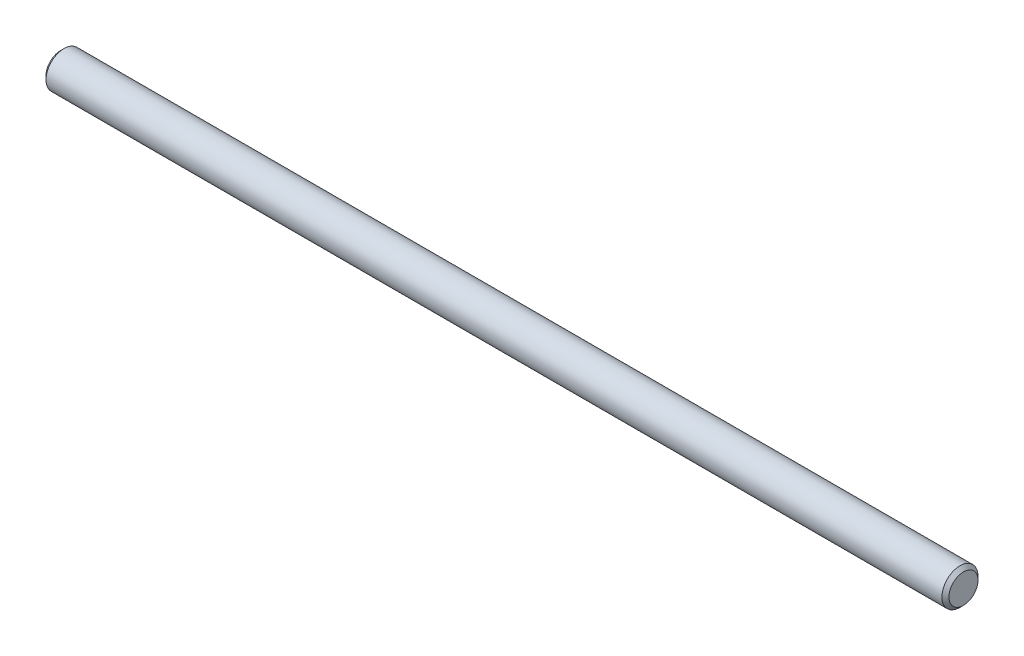
ISO-10303-21;
HEADER;
FILE_DESCRIPTION(('STEP AP214'),'2;1');
FILE_NAME('part.step','',(''),(''),'','','');
FILE_SCHEMA(('AUTOMOTIVE_DESIGN { 1 0 10303 214 1 1 1 1 }'));
ENDSEC;
DATA;
#1=APPLICATION_CONTEXT('core data for automotive mechanical design processes');
#2=APPLICATION_PROTOCOL_DEFINITION('international standard','automotive_design',2000,#1);
#3=PRODUCT_CONTEXT('',#1,'mechanical');
#4=PRODUCT('Part','Part','',(#3));
#5=PRODUCT_RELATED_PRODUCT_CATEGORY('part','',(#4));
#6=PRODUCT_DEFINITION_FORMATION('','',#4);
#7=PRODUCT_DEFINITION_CONTEXT('part definition',#1,'design');
#8=PRODUCT_DEFINITION('design','',#6,#7);
#9=PRODUCT_DEFINITION_SHAPE('','',#8);
#10=(LENGTH_UNIT() NAMED_UNIT(*) SI_UNIT(.MILLI.,.METRE.));
#11=(NAMED_UNIT(*) PLANE_ANGLE_UNIT() SI_UNIT($,.RADIAN.));
#12=(NAMED_UNIT(*) SI_UNIT($,.STERADIAN.) SOLID_ANGLE_UNIT());
#13=UNCERTAINTY_MEASURE_WITH_UNIT(LENGTH_MEASURE(1.E-05),#10,'distance_accuracy_value','');
#14=(GEOMETRIC_REPRESENTATION_CONTEXT(3) GLOBAL_UNCERTAINTY_ASSIGNED_CONTEXT((#13)) GLOBAL_UNIT_ASSIGNED_CONTEXT((#10,
#11,#12)) REPRESENTATION_CONTEXT('',''));
#15=CARTESIAN_POINT('',(0.,0.,0.));
#16=DIRECTION('',(0.,0.,1.));
#17=DIRECTION('',(1.,0.,0.));
#18=AXIS2_PLACEMENT_3D('',#15,#16,#17);
#19=CARTESIAN_POINT('',(0.,0.,0.));
#20=DIRECTION('',(1.,0.,0.));
#21=DIRECTION('',(0.,0.,-1.));
#22=AXIS2_PLACEMENT_3D('',#19,#20,#21);
#23=PLANE('',#22);
#24=CARTESIAN_POINT('',(0.,0.,0.));
#25=DIRECTION('',(-1.,0.,0.));
#26=DIRECTION('',(0.,0.,1.));
#27=AXIS2_PLACEMENT_3D('',#24,#25,#26);
#28=CIRCLE('',#27,2.00999999999996);
#29=CARTESIAN_POINT('',(0.,0.,2.00999999999996));
#30=VERTEX_POINT('',#29);
#31=EDGE_CURVE('E10',#30,#30,#28,.T.);
#32=ORIENTED_EDGE('',*,*,#31,.T.);
#33=EDGE_LOOP('',(#32));
#34=FACE_BOUND('',#33,.T.);
#35=ADVANCED_FACE('F43',(#34),#23,.F.);
#36=CARTESIAN_POINT('',(0.490000000000005,0.,0.));
#37=DIRECTION('',(1.,0.,0.));
#38=DIRECTION('',(0.,0.,-1.));
#39=AXIS2_PLACEMENT_3D('',#36,#37,#38);
#40=CONICAL_SURFACE('',#39,2.5,0.78539816339748);
#41=ORIENTED_EDGE('',*,*,#31,.F.);
#42=EDGE_LOOP('',(#41));
#43=FACE_BOUND('',#42,.T.);
#44=CARTESIAN_POINT('',(0.490000000000005,0.,0.));
#45=DIRECTION('',(-1.,0.,0.));
#46=DIRECTION('',(0.,0.,1.));
#47=AXIS2_PLACEMENT_3D('',#44,#45,#46);
#48=CIRCLE('',#47,2.5);
#49=CARTESIAN_POINT('',(0.490000000000005,0.,2.5));
#50=VERTEX_POINT('',#49);
#51=EDGE_CURVE('E49',#50,#50,#48,.T.);
#52=ORIENTED_EDGE('',*,*,#51,.T.);
#53=EDGE_LOOP('',(#52));
#54=FACE_BOUND('',#53,.T.);
#55=ADVANCED_FACE('F75',(#43,#54),#40,.T.);
#56=CARTESIAN_POINT('',(0.,0.,0.));
#57=DIRECTION('',(-1.,0.,0.));
#58=DIRECTION('',(0.,0.,1.));
#59=AXIS2_PLACEMENT_3D('',#56,#57,#58);
#60=CYLINDRICAL_SURFACE('',#59,2.5);
#61=ORIENTED_EDGE('',*,*,#51,.F.);
#62=EDGE_LOOP('',(#61));
#63=FACE_BOUND('',#62,.T.);
#64=CARTESIAN_POINT('',(124.51,0.,0.));
#65=DIRECTION('',(-1.,0.,0.));
#66=DIRECTION('',(0.,0.,1.));
#67=AXIS2_PLACEMENT_3D('',#64,#65,#66);
#68=CIRCLE('',#67,2.5);
#69=CARTESIAN_POINT('',(124.51,0.,2.5));
#70=VERTEX_POINT('',#69);
#71=EDGE_CURVE('E53',#70,#70,#68,.T.);
#72=ORIENTED_EDGE('',*,*,#71,.T.);
#73=EDGE_LOOP('',(#72));
#74=FACE_BOUND('',#73,.T.);
#75=ADVANCED_FACE('F71',(#63,#74),#60,.T.);
#76=CARTESIAN_POINT('',(125.,0.,0.));
#77=DIRECTION('',(-1.,0.,0.));
#78=DIRECTION('',(0.,0.,1.));
#79=AXIS2_PLACEMENT_3D('',#76,#77,#78);
#80=CONICAL_SURFACE('',#79,2.00999999999996,0.785398163397481);
#81=ORIENTED_EDGE('',*,*,#71,.F.);
#82=EDGE_LOOP('',(#81));
#83=FACE_BOUND('',#82,.T.);
#84=CARTESIAN_POINT('',(125.,0.,0.));
#85=DIRECTION('',(-1.,0.,0.));
#86=DIRECTION('',(0.,0.,1.));
#87=AXIS2_PLACEMENT_3D('',#84,#85,#86);
#88=CIRCLE('',#87,2.00999999999996);
#89=CARTESIAN_POINT('',(125.,0.,2.00999999999996));
#90=VERTEX_POINT('',#89);
#91=EDGE_CURVE('E57',#90,#90,#88,.T.);
#92=ORIENTED_EDGE('',*,*,#91,.T.);
#93=EDGE_LOOP('',(#92));
#94=FACE_BOUND('',#93,.T.);
#95=ADVANCED_FACE('F63',(#83,#94),#80,.T.);
#96=CARTESIAN_POINT('',(125.,2.00999999999996,0.));
#97=DIRECTION('',(-1.,0.,0.));
#98=DIRECTION('',(0.,0.,1.));
#99=AXIS2_PLACEMENT_3D('',#96,#97,#98);
#100=PLANE('',#99);
#101=ORIENTED_EDGE('',*,*,#91,.F.);
#102=EDGE_LOOP('',(#101));
#103=FACE_BOUND('',#102,.T.);
#104=ADVANCED_FACE('F65',(#103),#100,.F.);
#105=CLOSED_SHELL('',(#35,#55,#75,#95,#104));
#106=MANIFOLD_SOLID_BREP('B2',#105);
#107=ADVANCED_BREP_SHAPE_REPRESENTATION('',(#18,#106),#14);
#108=SHAPE_DEFINITION_REPRESENTATION(#9,#107);
ENDSEC;
END-ISO-10303-21;
